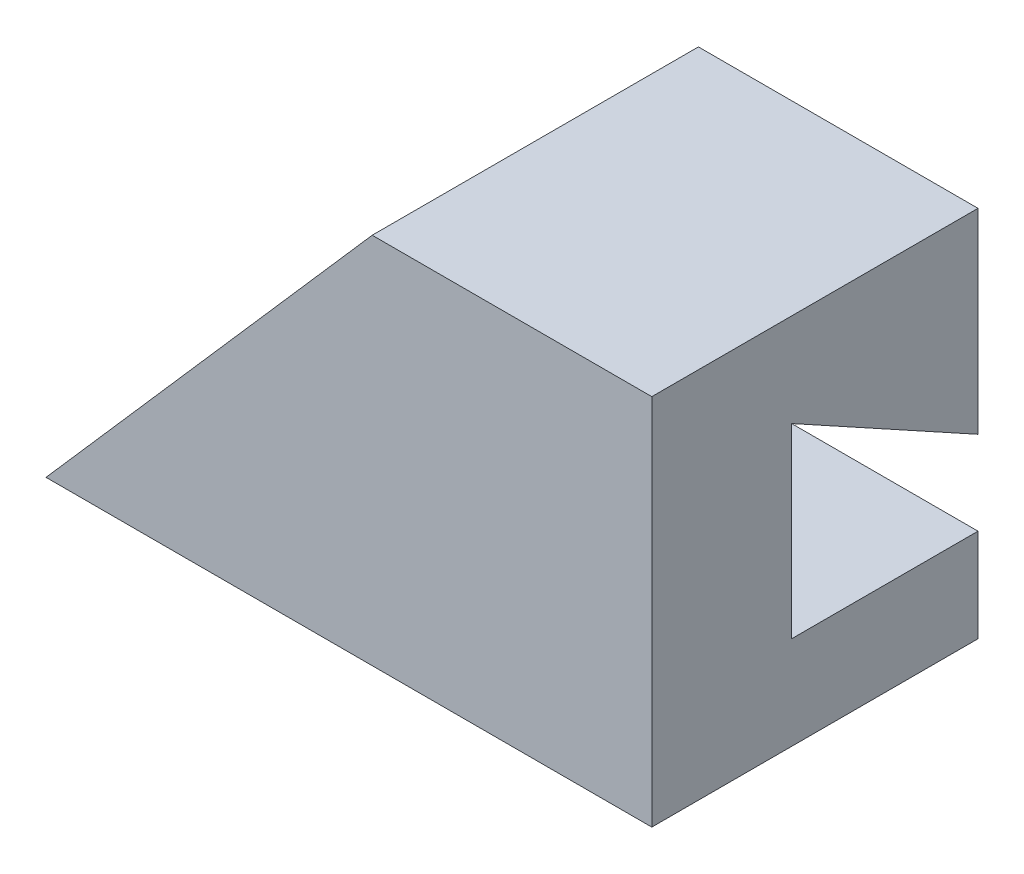
ISO-10303-21;
HEADER;
FILE_DESCRIPTION(('STEP AP214'),'2;1');
FILE_NAME('part.step','',(''),(''),'','','');
FILE_SCHEMA(('AUTOMOTIVE_DESIGN { 1 0 10303 214 1 1 1 1 }'));
ENDSEC;
DATA;
#1=APPLICATION_CONTEXT('core data for automotive mechanical design processes');
#2=APPLICATION_PROTOCOL_DEFINITION('international standard','automotive_design',2000,#1);
#3=PRODUCT_CONTEXT('',#1,'mechanical');
#4=PRODUCT('Part','Part','',(#3));
#5=PRODUCT_RELATED_PRODUCT_CATEGORY('part','',(#4));
#6=PRODUCT_DEFINITION_FORMATION('','',#4);
#7=PRODUCT_DEFINITION_CONTEXT('part definition',#1,'design');
#8=PRODUCT_DEFINITION('design','',#6,#7);
#9=PRODUCT_DEFINITION_SHAPE('','',#8);
#10=(LENGTH_UNIT() NAMED_UNIT(*) SI_UNIT(.MILLI.,.METRE.));
#11=(NAMED_UNIT(*) PLANE_ANGLE_UNIT() SI_UNIT($,.RADIAN.));
#12=(NAMED_UNIT(*) SI_UNIT($,.STERADIAN.) SOLID_ANGLE_UNIT());
#13=UNCERTAINTY_MEASURE_WITH_UNIT(LENGTH_MEASURE(1.E-05),#10,'distance_accuracy_value','');
#14=(GEOMETRIC_REPRESENTATION_CONTEXT(3) GLOBAL_UNCERTAINTY_ASSIGNED_CONTEXT((#13)) GLOBAL_UNIT_ASSIGNED_CONTEXT((#10,
#11,#12)) REPRESENTATION_CONTEXT('',''));
#15=CARTESIAN_POINT('',(0.,0.,0.));
#16=DIRECTION('',(0.,0.,1.));
#17=DIRECTION('',(1.,0.,0.));
#18=AXIS2_PLACEMENT_3D('',#15,#16,#17);
#19=CARTESIAN_POINT('',(65.,15.936944937833,21.2047249291921));
#20=DIRECTION('',(0.,0.,-1.));
#21=DIRECTION('',(0.,1.,0.));
#22=AXIS2_PLACEMENT_3D('',#19,#20,#21);
#23=PLANE('',#22);
#24=DIRECTION('',(-1.,0.,0.));
#25=VECTOR('',#24,1.);
#26=CARTESIAN_POINT('',(65.,15.936944937833,21.2047249291921));
#27=LINE('',#26,#25);
#28=CARTESIAN_POINT('',(65.,15.936944937833,21.2047249291921));
#29=VERTEX_POINT('',#28);
#30=CARTESIAN_POINT('',(35.0000000000001,15.936944937833,21.2047249291921));
#31=VERTEX_POINT('',#30);
#32=EDGE_CURVE('E164',#29,#31,#27,.T.);
#33=ORIENTED_EDGE('',*,*,#32,.T.);
#34=DIRECTION('',(0.658504607868518,0.752576694706878,0.));
#35=VECTOR('',#34,1.);
#36=CARTESIAN_POINT('',(35.0000000000001,15.936944937833,21.2047249291921));
#37=LINE('',#36,#35);
#38=CARTESIAN_POINT('',(0.,-24.063055062167,21.2047249291921));
#39=VERTEX_POINT('',#38);
#40=EDGE_CURVE('E124',#31,#39,#37,.F.);
#41=ORIENTED_EDGE('',*,*,#40,.T.);
#42=DIRECTION('',(-1.,0.,0.));
#43=VECTOR('',#42,1.);
#44=CARTESIAN_POINT('',(65.,-24.063055062167,21.2047249291921));
#45=LINE('',#44,#43);
#46=CARTESIAN_POINT('',(65.,-24.063055062167,21.2047249291921));
#47=VERTEX_POINT('',#46);
#48=EDGE_CURVE('E106',#47,#39,#45,.T.);
#49=ORIENTED_EDGE('',*,*,#48,.F.);
#50=DIRECTION('',(0.,-1.,0.));
#51=VECTOR('',#50,1.);
#52=CARTESIAN_POINT('',(65.,15.936944937833,21.2047249291921));
#53=LINE('',#52,#51);
#54=EDGE_CURVE('E113',#29,#47,#53,.T.);
#55=ORIENTED_EDGE('',*,*,#54,.F.);
#56=EDGE_LOOP('',(#33,#41,#49,#55));
#57=FACE_BOUND('',#56,.T.);
#58=ADVANCED_FACE('F35',(#57),#23,.F.);
#59=CARTESIAN_POINT('',(65.,-24.063055062167,21.2047249291921));
#60=DIRECTION('',(0.,1.,0.));
#61=DIRECTION('',(0.,0.,1.));
#62=AXIS2_PLACEMENT_3D('',#59,#60,#61);
#63=PLANE('',#62);
#64=DIRECTION('',(0.,0.,-1.));
#65=VECTOR('',#64,1.);
#66=CARTESIAN_POINT('',(0.,-24.063055062167,21.2047249291921));
#67=LINE('',#66,#65);
#68=CARTESIAN_POINT('',(0.,-24.063055062167,-13.7952750708079));
#69=VERTEX_POINT('',#68);
#70=EDGE_CURVE('E122',#39,#69,#67,.T.);
#71=ORIENTED_EDGE('',*,*,#70,.T.);
#72=DIRECTION('',(-1.,0.,0.));
#73=VECTOR('',#72,1.);
#74=CARTESIAN_POINT('',(65.,-24.063055062167,-13.7952750708079));
#75=LINE('',#74,#73);
#76=CARTESIAN_POINT('',(65.,-24.063055062167,-13.7952750708079));
#77=VERTEX_POINT('',#76);
#78=EDGE_CURVE('E109',#77,#69,#75,.T.);
#79=ORIENTED_EDGE('',*,*,#78,.F.);
#80=DIRECTION('',(0.,0.,-1.));
#81=VECTOR('',#80,1.);
#82=CARTESIAN_POINT('',(65.,-24.063055062167,21.2047249291921));
#83=LINE('',#82,#81);
#84=EDGE_CURVE('E102',#47,#77,#83,.T.);
#85=ORIENTED_EDGE('',*,*,#84,.F.);
#86=ORIENTED_EDGE('',*,*,#48,.T.);
#87=EDGE_LOOP('',(#71,#79,#85,#86));
#88=FACE_BOUND('',#87,.T.);
#89=ADVANCED_FACE('F104',(#88),#63,.F.);
#90=CARTESIAN_POINT('',(65.,-24.063055062167,-13.7952750708079));
#91=DIRECTION('',(0.,0.,1.));
#92=DIRECTION('',(0.,-1.,0.));
#93=AXIS2_PLACEMENT_3D('',#90,#91,#92);
#94=PLANE('',#93);
#95=ORIENTED_EDGE('',*,*,#78,.T.);
#96=DIRECTION('',(-0.658504607868518,-0.752576694706878,0.));
#97=VECTOR('',#96,1.);
#98=CARTESIAN_POINT('',(35.0000000000001,15.936944937833,-13.7952750708079));
#99=LINE('',#98,#97);
#100=CARTESIAN_POINT('',(8.75000000000011,-14.063055062167,-13.7952750708079));
#101=VERTEX_POINT('',#100);
#102=EDGE_CURVE('E134',#69,#101,#99,.F.);
#103=ORIENTED_EDGE('',*,*,#102,.T.);
#104=DIRECTION('',(-1.,0.,0.));
#105=VECTOR('',#104,1.);
#106=CARTESIAN_POINT('',(65.,-14.063055062167,-13.7952750708079));
#107=LINE('',#106,#105);
#108=CARTESIAN_POINT('',(65.,-14.063055062167,-13.7952750708079));
#109=VERTEX_POINT('',#108);
#110=EDGE_CURVE('E129',#109,#101,#107,.T.);
#111=ORIENTED_EDGE('',*,*,#110,.F.);
#112=DIRECTION('',(0.,1.,0.));
#113=VECTOR('',#112,1.);
#114=CARTESIAN_POINT('',(65.,-24.063055062167,-13.7952750708079));
#115=LINE('',#114,#113);
#116=EDGE_CURVE('E112',#77,#109,#115,.T.);
#117=ORIENTED_EDGE('',*,*,#116,.F.);
#118=EDGE_LOOP('',(#95,#103,#111,#117));
#119=FACE_BOUND('',#118,.T.);
#120=ADVANCED_FACE('F181',(#119),#94,.F.);
#121=CARTESIAN_POINT('',(65.,-14.063055062167,-13.7952750708079));
#122=DIRECTION('',(0.,-1.,0.));
#123=DIRECTION('',(0.,0.,-1.));
#124=AXIS2_PLACEMENT_3D('',#121,#122,#123);
#125=PLANE('',#124);
#126=ORIENTED_EDGE('',*,*,#110,.T.);
#127=DIRECTION('',(0.,0.,-1.));
#128=VECTOR('',#127,1.);
#129=CARTESIAN_POINT('',(8.75000000000012,-14.063055062167,-13.7952750708079));
#130=LINE('',#129,#128);
#131=CARTESIAN_POINT('',(8.75000000000011,-14.063055062167,6.20472492919208));
#132=VERTEX_POINT('',#131);
#133=EDGE_CURVE('E136',#101,#132,#130,.F.);
#134=ORIENTED_EDGE('',*,*,#133,.T.);
#135=DIRECTION('',(-1.,0.,0.));
#136=VECTOR('',#135,1.);
#137=CARTESIAN_POINT('',(65.,-14.063055062167,6.20472492919208));
#138=LINE('',#137,#136);
#139=CARTESIAN_POINT('',(65.,-14.063055062167,6.20472492919208));
#140=VERTEX_POINT('',#139);
#141=EDGE_CURVE('E144',#140,#132,#138,.T.);
#142=ORIENTED_EDGE('',*,*,#141,.F.);
#143=DIRECTION('',(0.,0.,1.));
#144=VECTOR('',#143,1.);
#145=CARTESIAN_POINT('',(65.,-14.063055062167,-13.7952750708079));
#146=LINE('',#145,#144);
#147=EDGE_CURVE('E176',#109,#140,#146,.T.);
#148=ORIENTED_EDGE('',*,*,#147,.F.);
#149=EDGE_LOOP('',(#126,#134,#142,#148));
#150=FACE_BOUND('',#149,.T.);
#151=ADVANCED_FACE('F142',(#150),#125,.F.);
#152=CARTESIAN_POINT('',(65.,-14.063055062167,6.20472492919208));
#153=DIRECTION('',(0.,0.,1.));
#154=DIRECTION('',(1.,0.,0.));
#155=AXIS2_PLACEMENT_3D('',#152,#153,#154);
#156=PLANE('',#155);
#157=ORIENTED_EDGE('',*,*,#141,.T.);
#158=DIRECTION('',(-0.658504607868518,-0.752576694706878,0.));
#159=VECTOR('',#158,1.);
#160=CARTESIAN_POINT('',(35.0000000000001,15.936944937833,6.20472492919208));
#161=LINE('',#160,#159);
#162=CARTESIAN_POINT('',(26.2500000000001,5.93694493783304,6.20472492919208));
#163=VERTEX_POINT('',#162);
#164=EDGE_CURVE('E58',#132,#163,#161,.F.);
#165=ORIENTED_EDGE('',*,*,#164,.T.);
#166=DIRECTION('',(-1.,0.,0.));
#167=VECTOR('',#166,1.);
#168=CARTESIAN_POINT('',(65.,5.93694493783304,6.20472492919208));
#169=LINE('',#168,#167);
#170=CARTESIAN_POINT('',(65.,5.93694493783304,6.20472492919208));
#171=VERTEX_POINT('',#170);
#172=EDGE_CURVE('E151',#171,#163,#169,.T.);
#173=ORIENTED_EDGE('',*,*,#172,.F.);
#174=DIRECTION('',(0.,1.,0.));
#175=VECTOR('',#174,1.);
#176=CARTESIAN_POINT('',(65.,-14.063055062167,6.20472492919208));
#177=LINE('',#176,#175);
#178=EDGE_CURVE('E150',#140,#171,#177,.T.);
#179=ORIENTED_EDGE('',*,*,#178,.F.);
#180=EDGE_LOOP('',(#157,#165,#173,#179));
#181=FACE_BOUND('',#180,.T.);
#182=ADVANCED_FACE('F149',(#181),#156,.F.);
#183=CARTESIAN_POINT('',(65.,5.93694493783304,6.20472492919208));
#184=DIRECTION('',(0.,0.876215908676647,-0.481918749772156));
#185=DIRECTION('',(0.,0.481918749772156,0.876215908676647));
#186=AXIS2_PLACEMENT_3D('',#183,#184,#185);
#187=PLANE('',#186);
#188=ORIENTED_EDGE('',*,*,#172,.T.);
#189=DIRECTION('',(0.3885471129896,0.444053843416686,0.807370624393975));
#190=VECTOR('',#189,1.);
#191=CARTESIAN_POINT('',(23.022305400657,2.24815111001239,-0.502172939572722));
#192=LINE('',#191,#190);
#193=CARTESIAN_POINT('',(16.6250000000001,-5.06305506216696,-13.7952750708079));
#194=VERTEX_POINT('',#193);
#195=EDGE_CURVE('E44',#163,#194,#192,.F.);
#196=ORIENTED_EDGE('',*,*,#195,.T.);
#197=DIRECTION('',(-1.,0.,0.));
#198=VECTOR('',#197,1.);
#199=CARTESIAN_POINT('',(65.,-5.06305506216696,-13.7952750708079));
#200=LINE('',#199,#198);
#201=CARTESIAN_POINT('',(65.,-5.06305506216696,-13.7952750708079));
#202=VERTEX_POINT('',#201);
#203=EDGE_CURVE('E161',#202,#194,#200,.T.);
#204=ORIENTED_EDGE('',*,*,#203,.F.);
#205=DIRECTION('',(0.,-0.481918749772156,-0.876215908676647));
#206=VECTOR('',#205,1.);
#207=CARTESIAN_POINT('',(65.,5.93694493783304,6.20472492919208));
#208=LINE('',#207,#206);
#209=EDGE_CURVE('E172',#171,#202,#208,.T.);
#210=ORIENTED_EDGE('',*,*,#209,.F.);
#211=EDGE_LOOP('',(#188,#196,#204,#210));
#212=FACE_BOUND('',#211,.T.);
#213=ADVANCED_FACE('F171',(#212),#187,.F.);
#214=CARTESIAN_POINT('',(65.,-5.06305506216696,-13.7952750708079));
#215=DIRECTION('',(0.,0.,1.));
#216=DIRECTION('',(1.,0.,0.));
#217=AXIS2_PLACEMENT_3D('',#214,#215,#216);
#218=PLANE('',#217);
#219=ORIENTED_EDGE('',*,*,#203,.T.);
#220=DIRECTION('',(-0.658504607868518,-0.752576694706878,0.));
#221=VECTOR('',#220,1.);
#222=CARTESIAN_POINT('',(35.0000000000001,15.936944937833,-13.7952750708079));
#223=LINE('',#222,#221);
#224=CARTESIAN_POINT('',(35.0000000000001,15.936944937833,-13.7952750708079));
#225=VERTEX_POINT('',#224);
#226=EDGE_CURVE('E11',#194,#225,#223,.F.);
#227=ORIENTED_EDGE('',*,*,#226,.T.);
#228=DIRECTION('',(-1.,0.,0.));
#229=VECTOR('',#228,1.);
#230=CARTESIAN_POINT('',(65.,15.936944937833,-13.7952750708079));
#231=LINE('',#230,#229);
#232=CARTESIAN_POINT('',(65.,15.936944937833,-13.7952750708079));
#233=VERTEX_POINT('',#232);
#234=EDGE_CURVE('E160',#233,#225,#231,.T.);
#235=ORIENTED_EDGE('',*,*,#234,.F.);
#236=DIRECTION('',(0.,1.,0.));
#237=VECTOR('',#236,1.);
#238=CARTESIAN_POINT('',(65.,-5.06305506216696,-13.7952750708079));
#239=LINE('',#238,#237);
#240=EDGE_CURVE('E173',#202,#233,#239,.T.);
#241=ORIENTED_EDGE('',*,*,#240,.F.);
#242=EDGE_LOOP('',(#219,#227,#235,#241));
#243=FACE_BOUND('',#242,.T.);
#244=ADVANCED_FACE('F158',(#243),#218,.F.);
#245=CARTESIAN_POINT('',(65.,15.936944937833,-13.7952750708079));
#246=DIRECTION('',(0.,-1.,0.));
#247=DIRECTION('',(0.,0.,-1.));
#248=AXIS2_PLACEMENT_3D('',#245,#246,#247);
#249=PLANE('',#248);
#250=ORIENTED_EDGE('',*,*,#234,.T.);
#251=DIRECTION('',(0.,0.,1.));
#252=VECTOR('',#251,1.);
#253=CARTESIAN_POINT('',(35.0000000000001,15.936944937833,-13.7952750708079));
#254=LINE('',#253,#252);
#255=EDGE_CURVE('E125',#225,#31,#254,.T.);
#256=ORIENTED_EDGE('',*,*,#255,.T.);
#257=ORIENTED_EDGE('',*,*,#32,.F.);
#258=DIRECTION('',(0.,0.,1.));
#259=VECTOR('',#258,1.);
#260=CARTESIAN_POINT('',(65.,15.936944937833,-13.7952750708079));
#261=LINE('',#260,#259);
#262=EDGE_CURVE('E118',#233,#29,#261,.T.);
#263=ORIENTED_EDGE('',*,*,#262,.F.);
#264=EDGE_LOOP('',(#250,#256,#257,#263));
#265=FACE_BOUND('',#264,.T.);
#266=ADVANCED_FACE('F163',(#265),#249,.F.);
#267=CARTESIAN_POINT('',(65.,0.,0.));
#268=DIRECTION('',(1.,0.,0.));
#269=DIRECTION('',(0.,0.,-1.));
#270=AXIS2_PLACEMENT_3D('',#267,#268,#269);
#271=PLANE('',#270);
#272=ORIENTED_EDGE('',*,*,#54,.T.);
#273=ORIENTED_EDGE('',*,*,#84,.T.);
#274=ORIENTED_EDGE('',*,*,#116,.T.);
#275=ORIENTED_EDGE('',*,*,#147,.T.);
#276=ORIENTED_EDGE('',*,*,#178,.T.);
#277=ORIENTED_EDGE('',*,*,#209,.T.);
#278=ORIENTED_EDGE('',*,*,#240,.T.);
#279=ORIENTED_EDGE('',*,*,#262,.T.);
#280=EDGE_LOOP('',(#272,#273,#274,#275,#276,#277,#278,#279));
#281=FACE_BOUND('',#280,.T.);
#282=ADVANCED_FACE('F116',(#281),#271,.T.);
#283=CARTESIAN_POINT('',(35.0000000000001,15.936944937833,-13.7952750708079));
#284=DIRECTION('',(0.752576694706878,-0.658504607868518,0.));
#285=DIRECTION('',(0.,0.,1.));
#286=AXIS2_PLACEMENT_3D('',#283,#284,#285);
#287=PLANE('',#286);
#288=ORIENTED_EDGE('',*,*,#102,.F.);
#289=ORIENTED_EDGE('',*,*,#70,.F.);
#290=ORIENTED_EDGE('',*,*,#40,.F.);
#291=ORIENTED_EDGE('',*,*,#255,.F.);
#292=ORIENTED_EDGE('',*,*,#226,.F.);
#293=ORIENTED_EDGE('',*,*,#195,.F.);
#294=ORIENTED_EDGE('',*,*,#164,.F.);
#295=ORIENTED_EDGE('',*,*,#133,.F.);
#296=EDGE_LOOP('',(#288,#289,#290,#291,#292,#293,#294,#295));
#297=FACE_BOUND('',#296,.T.);
#298=ADVANCED_FACE('F38',(#297),#287,.F.);
#299=CLOSED_SHELL('',(#58,#89,#120,#151,#182,#213,#244,#266,#282,#298));
#300=MANIFOLD_SOLID_BREP('B2',#299);
#301=ADVANCED_BREP_SHAPE_REPRESENTATION('',(#18,#300),#14);
#302=SHAPE_DEFINITION_REPRESENTATION(#9,#301);
ENDSEC;
END-ISO-10303-21;
